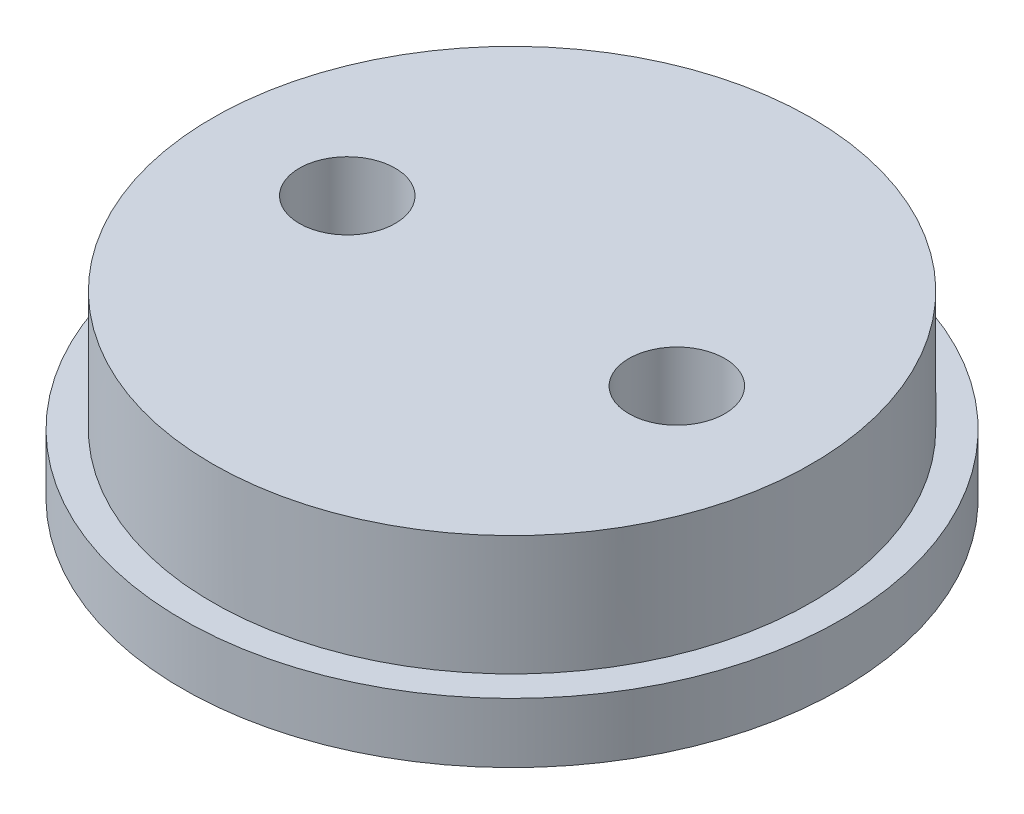
ISO-10303-21;
HEADER;
FILE_DESCRIPTION(('STEP AP214'),'2;1');
FILE_NAME('part.step','',(''),(''),'','','');
FILE_SCHEMA(('AUTOMOTIVE_DESIGN { 1 0 10303 214 1 1 1 1 }'));
ENDSEC;
DATA;
#1=APPLICATION_CONTEXT('core data for automotive mechanical design processes');
#2=APPLICATION_PROTOCOL_DEFINITION('international standard','automotive_design',2000,#1);
#3=PRODUCT_CONTEXT('',#1,'mechanical');
#4=PRODUCT('Part','Part','',(#3));
#5=PRODUCT_RELATED_PRODUCT_CATEGORY('part','',(#4));
#6=PRODUCT_DEFINITION_FORMATION('','',#4);
#7=PRODUCT_DEFINITION_CONTEXT('part definition',#1,'design');
#8=PRODUCT_DEFINITION('design','',#6,#7);
#9=PRODUCT_DEFINITION_SHAPE('','',#8);
#10=(LENGTH_UNIT() NAMED_UNIT(*) SI_UNIT(.MILLI.,.METRE.));
#11=(NAMED_UNIT(*) PLANE_ANGLE_UNIT() SI_UNIT($,.RADIAN.));
#12=(NAMED_UNIT(*) SI_UNIT($,.STERADIAN.) SOLID_ANGLE_UNIT());
#13=UNCERTAINTY_MEASURE_WITH_UNIT(LENGTH_MEASURE(1.E-05),#10,'distance_accuracy_value','');
#14=(GEOMETRIC_REPRESENTATION_CONTEXT(3) GLOBAL_UNCERTAINTY_ASSIGNED_CONTEXT((#13)) GLOBAL_UNIT_ASSIGNED_CONTEXT((#10,
#11,#12)) REPRESENTATION_CONTEXT('',''));
#15=CARTESIAN_POINT('',(0.,0.,0.));
#16=DIRECTION('',(0.,0.,1.));
#17=DIRECTION('',(1.,0.,0.));
#18=AXIS2_PLACEMENT_3D('',#15,#16,#17);
#19=CARTESIAN_POINT('',(0.,6.,0.));
#20=DIRECTION('',(0.,-1.,0.));
#21=DIRECTION('',(0.,0.,-1.));
#22=AXIS2_PLACEMENT_3D('',#19,#20,#21);
#23=CYLINDRICAL_SURFACE('',#22,10.);
#24=CARTESIAN_POINT('',(0.,6.,0.));
#25=DIRECTION('',(0.,1.,0.));
#26=DIRECTION('',(0.,0.,1.));
#27=AXIS2_PLACEMENT_3D('',#24,#25,#26);
#28=CIRCLE('',#27,10.);
#29=CARTESIAN_POINT('',(0.,6.,10.));
#30=VERTEX_POINT('',#29);
#31=EDGE_CURVE('E39',#30,#30,#28,.T.);
#32=ORIENTED_EDGE('',*,*,#31,.F.);
#33=EDGE_LOOP('',(#32));
#34=FACE_BOUND('',#33,.T.);
#35=CARTESIAN_POINT('',(0.,2.,0.));
#36=DIRECTION('',(0.,-1.,0.));
#37=DIRECTION('',(0.,0.,-1.));
#38=AXIS2_PLACEMENT_3D('',#35,#36,#37);
#39=CIRCLE('',#38,10.);
#40=CARTESIAN_POINT('',(0.,2.,-10.));
#41=VERTEX_POINT('',#40);
#42=EDGE_CURVE('E10',#41,#41,#39,.T.);
#43=ORIENTED_EDGE('',*,*,#42,.F.);
#44=EDGE_LOOP('',(#43));
#45=FACE_BOUND('',#44,.T.);
#46=ADVANCED_FACE('F33',(#34,#45),#23,.T.);
#47=CARTESIAN_POINT('',(0.,6.,0.));
#48=DIRECTION('',(0.,1.,0.));
#49=DIRECTION('',(0.,0.,1.));
#50=AXIS2_PLACEMENT_3D('',#47,#48,#49);
#51=PLANE('',#50);
#52=CARTESIAN_POINT('',(-5.5,6.,0.));
#53=DIRECTION('',(0.,1.,0.));
#54=DIRECTION('',(0.,0.,1.));
#55=AXIS2_PLACEMENT_3D('',#52,#53,#54);
#56=CIRCLE('',#55,1.6);
#57=CARTESIAN_POINT('',(-5.5,6.,1.6));
#58=VERTEX_POINT('',#57);
#59=EDGE_CURVE('E51',#58,#58,#56,.F.);
#60=ORIENTED_EDGE('',*,*,#59,.T.);
#61=EDGE_LOOP('',(#60));
#62=FACE_BOUND('',#61,.T.);
#63=CARTESIAN_POINT('',(5.5,6.,0.));
#64=DIRECTION('',(0.,1.,0.));
#65=DIRECTION('',(0.,0.,1.));
#66=AXIS2_PLACEMENT_3D('',#63,#64,#65);
#67=CIRCLE('',#66,1.6);
#68=CARTESIAN_POINT('',(5.5,6.,1.6));
#69=VERTEX_POINT('',#68);
#70=EDGE_CURVE('E55',#69,#69,#67,.F.);
#71=ORIENTED_EDGE('',*,*,#70,.T.);
#72=EDGE_LOOP('',(#71));
#73=FACE_BOUND('',#72,.T.);
#74=ORIENTED_EDGE('',*,*,#31,.T.);
#75=EDGE_LOOP('',(#74));
#76=FACE_BOUND('',#75,.T.);
#77=ADVANCED_FACE('F80',(#62,#73,#76),#51,.T.);
#78=CARTESIAN_POINT('',(0.,2.,0.));
#79=DIRECTION('',(0.,-1.,0.));
#80=DIRECTION('',(0.,0.,-1.));
#81=AXIS2_PLACEMENT_3D('',#78,#79,#80);
#82=CYLINDRICAL_SURFACE('',#81,11.);
#83=CARTESIAN_POINT('',(0.,2.,0.));
#84=DIRECTION('',(0.,-1.,0.));
#85=DIRECTION('',(0.,0.,-1.));
#86=AXIS2_PLACEMENT_3D('',#83,#84,#85);
#87=CIRCLE('',#86,11.);
#88=CARTESIAN_POINT('',(0.,2.,-11.));
#89=VERTEX_POINT('',#88);
#90=EDGE_CURVE('E43',#89,#89,#87,.T.);
#91=ORIENTED_EDGE('',*,*,#90,.T.);
#92=EDGE_LOOP('',(#91));
#93=FACE_BOUND('',#92,.T.);
#94=CARTESIAN_POINT('',(0.,0.,0.));
#95=DIRECTION('',(0.,-1.,0.));
#96=DIRECTION('',(0.,0.,-1.));
#97=AXIS2_PLACEMENT_3D('',#94,#95,#96);
#98=CIRCLE('',#97,11.);
#99=CARTESIAN_POINT('',(0.,0.,-11.));
#100=VERTEX_POINT('',#99);
#101=EDGE_CURVE('E47',#100,#100,#98,.T.);
#102=ORIENTED_EDGE('',*,*,#101,.F.);
#103=EDGE_LOOP('',(#102));
#104=FACE_BOUND('',#103,.T.);
#105=ADVANCED_FACE('F85',(#93,#104),#82,.T.);
#106=CARTESIAN_POINT('',(0.,2.,0.));
#107=DIRECTION('',(0.,-1.,0.));
#108=DIRECTION('',(0.,0.,-1.));
#109=AXIS2_PLACEMENT_3D('',#106,#107,#108);
#110=PLANE('',#109);
#111=ORIENTED_EDGE('',*,*,#42,.T.);
#112=EDGE_LOOP('',(#111));
#113=FACE_BOUND('',#112,.T.);
#114=ORIENTED_EDGE('',*,*,#90,.F.);
#115=EDGE_LOOP('',(#114));
#116=FACE_BOUND('',#115,.T.);
#117=ADVANCED_FACE('F92',(#113,#116),#110,.F.);
#118=CARTESIAN_POINT('',(0.,0.,0.));
#119=DIRECTION('',(0.,1.,0.));
#120=DIRECTION('',(0.,0.,1.));
#121=AXIS2_PLACEMENT_3D('',#118,#119,#120);
#122=PLANE('',#121);
#123=CARTESIAN_POINT('',(-5.5,0.,0.));
#124=DIRECTION('',(0.,1.,0.));
#125=DIRECTION('',(0.,0.,1.));
#126=AXIS2_PLACEMENT_3D('',#123,#124,#125);
#127=CIRCLE('',#126,1.6);
#128=CARTESIAN_POINT('',(-5.5,0.,1.6));
#129=VERTEX_POINT('',#128);
#130=EDGE_CURVE('E58',#129,#129,#127,.T.);
#131=ORIENTED_EDGE('',*,*,#130,.T.);
#132=EDGE_LOOP('',(#131));
#133=FACE_BOUND('',#132,.T.);
#134=CARTESIAN_POINT('',(5.5,0.,0.));
#135=DIRECTION('',(0.,1.,0.));
#136=DIRECTION('',(0.,0.,1.));
#137=AXIS2_PLACEMENT_3D('',#134,#135,#136);
#138=CIRCLE('',#137,1.6);
#139=CARTESIAN_POINT('',(5.5,0.,1.6));
#140=VERTEX_POINT('',#139);
#141=EDGE_CURVE('E59',#140,#140,#138,.T.);
#142=ORIENTED_EDGE('',*,*,#141,.T.);
#143=EDGE_LOOP('',(#142));
#144=FACE_BOUND('',#143,.T.);
#145=ORIENTED_EDGE('',*,*,#101,.T.);
#146=EDGE_LOOP('',(#145));
#147=FACE_BOUND('',#146,.T.);
#148=ADVANCED_FACE('F65',(#133,#144,#147),#122,.F.);
#149=CARTESIAN_POINT('',(5.5,15.,0.));
#150=DIRECTION('',(0.,-1.,0.));
#151=DIRECTION('',(0.,0.,-1.));
#152=AXIS2_PLACEMENT_3D('',#149,#150,#151);
#153=CYLINDRICAL_SURFACE('',#152,1.6);
#154=ORIENTED_EDGE('',*,*,#70,.F.);
#155=EDGE_LOOP('',(#154));
#156=FACE_BOUND('',#155,.T.);
#157=ORIENTED_EDGE('',*,*,#141,.F.);
#158=EDGE_LOOP('',(#157));
#159=FACE_BOUND('',#158,.T.);
#160=ADVANCED_FACE('F70',(#156,#159),#153,.F.);
#161=CARTESIAN_POINT('',(-5.5,15.,0.));
#162=DIRECTION('',(0.,-1.,0.));
#163=DIRECTION('',(0.,0.,-1.));
#164=AXIS2_PLACEMENT_3D('',#161,#162,#163);
#165=CYLINDRICAL_SURFACE('',#164,1.6);
#166=ORIENTED_EDGE('',*,*,#59,.F.);
#167=EDGE_LOOP('',(#166));
#168=FACE_BOUND('',#167,.T.);
#169=ORIENTED_EDGE('',*,*,#130,.F.);
#170=EDGE_LOOP('',(#169));
#171=FACE_BOUND('',#170,.T.);
#172=ADVANCED_FACE('F68',(#168,#171),#165,.F.);
#173=CLOSED_SHELL('',(#46,#77,#105,#117,#148,#160,#172));
#174=MANIFOLD_SOLID_BREP('B2',#173);
#175=ADVANCED_BREP_SHAPE_REPRESENTATION('',(#18,#174),#14);
#176=SHAPE_DEFINITION_REPRESENTATION(#9,#175);
ENDSEC;
END-ISO-10303-21;
